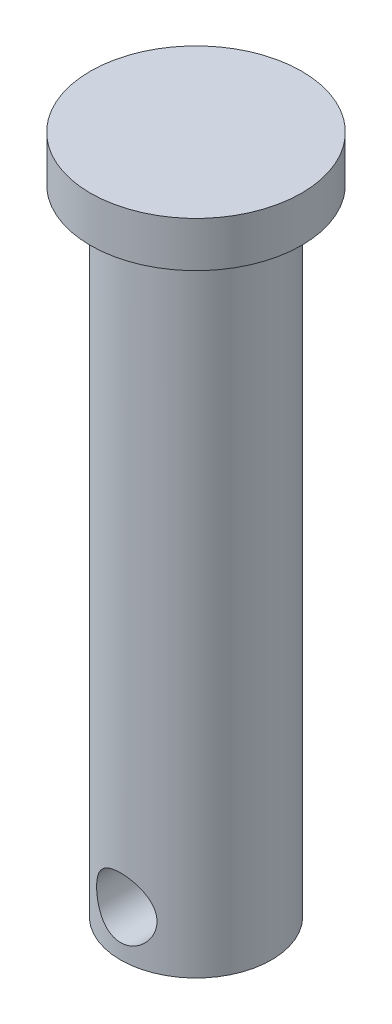
ISO-10303-21;
HEADER;
FILE_DESCRIPTION(('STEP AP214'),'2;1');
FILE_NAME('part.step','',(''),(''),'','','');
FILE_SCHEMA(('AUTOMOTIVE_DESIGN { 1 0 10303 214 1 1 1 1 }'));
ENDSEC;
DATA;
#1=APPLICATION_CONTEXT('core data for automotive mechanical design processes');
#2=APPLICATION_PROTOCOL_DEFINITION('international standard','automotive_design',2000,#1);
#3=PRODUCT_CONTEXT('',#1,'mechanical');
#4=PRODUCT('Part','Part','',(#3));
#5=PRODUCT_RELATED_PRODUCT_CATEGORY('part','',(#4));
#6=PRODUCT_DEFINITION_FORMATION('','',#4);
#7=PRODUCT_DEFINITION_CONTEXT('part definition',#1,'design');
#8=PRODUCT_DEFINITION('design','',#6,#7);
#9=PRODUCT_DEFINITION_SHAPE('','',#8);
#10=(LENGTH_UNIT() NAMED_UNIT(*) SI_UNIT(.MILLI.,.METRE.));
#11=(NAMED_UNIT(*) PLANE_ANGLE_UNIT() SI_UNIT($,.RADIAN.));
#12=(NAMED_UNIT(*) SI_UNIT($,.STERADIAN.) SOLID_ANGLE_UNIT());
#13=UNCERTAINTY_MEASURE_WITH_UNIT(LENGTH_MEASURE(1.E-05),#10,'distance_accuracy_value','');
#14=(GEOMETRIC_REPRESENTATION_CONTEXT(3) GLOBAL_UNCERTAINTY_ASSIGNED_CONTEXT((#13)) GLOBAL_UNIT_ASSIGNED_CONTEXT((#10,
#11,#12)) REPRESENTATION_CONTEXT('',''));
#15=CARTESIAN_POINT('',(0.,0.,0.));
#16=DIRECTION('',(0.,0.,1.));
#17=DIRECTION('',(1.,0.,0.));
#18=AXIS2_PLACEMENT_3D('',#15,#16,#17);
#19=CARTESIAN_POINT('',(0.,-3.,0.));
#20=DIRECTION('',(0.,1.,0.));
#21=DIRECTION('',(0.,0.,1.));
#22=AXIS2_PLACEMENT_3D('',#19,#20,#21);
#23=CYLINDRICAL_SURFACE('',#22,7.);
#24=CARTESIAN_POINT('',(0.,-3.,0.));
#25=DIRECTION('',(0.,1.,0.));
#26=DIRECTION('',(1.,0.,0.));
#27=AXIS2_PLACEMENT_3D('',#24,#25,#26);
#28=CIRCLE('',#27,7.);
#29=CARTESIAN_POINT('',(7.,-3.,0.));
#30=VERTEX_POINT('',#29);
#31=EDGE_CURVE('E10',#30,#30,#28,.T.);
#32=ORIENTED_EDGE('',*,*,#31,.T.);
#33=EDGE_LOOP('',(#32));
#34=FACE_BOUND('',#33,.T.);
#35=CARTESIAN_POINT('',(0.,0.,0.));
#36=DIRECTION('',(0.,1.,0.));
#37=DIRECTION('',(1.,0.,0.));
#38=AXIS2_PLACEMENT_3D('',#35,#36,#37);
#39=CIRCLE('',#38,7.);
#40=CARTESIAN_POINT('',(7.,0.,0.));
#41=VERTEX_POINT('',#40);
#42=EDGE_CURVE('E23',#41,#41,#39,.T.);
#43=ORIENTED_EDGE('',*,*,#42,.F.);
#44=EDGE_LOOP('',(#43));
#45=FACE_BOUND('',#44,.T.);
#46=ADVANCED_FACE('F15',(#34,#45),#23,.T.);
#47=CARTESIAN_POINT('',(0.,-3.,0.));
#48=DIRECTION('',(0.,1.,0.));
#49=DIRECTION('',(0.,0.,1.));
#50=AXIS2_PLACEMENT_3D('',#47,#48,#49);
#51=PLANE('',#50);
#52=CARTESIAN_POINT('',(0.,-3.,0.));
#53=DIRECTION('',(0.,1.,0.));
#54=DIRECTION('',(1.,0.,0.));
#55=AXIS2_PLACEMENT_3D('',#52,#53,#54);
#56=CIRCLE('',#55,4.);
#57=CARTESIAN_POINT('',(4.,-3.,0.));
#58=VERTEX_POINT('',#57);
#59=EDGE_CURVE('E29',#58,#58,#56,.T.);
#60=ORIENTED_EDGE('',*,*,#59,.T.);
#61=EDGE_LOOP('',(#60));
#62=FACE_BOUND('',#61,.T.);
#63=ORIENTED_EDGE('',*,*,#31,.F.);
#64=EDGE_LOOP('',(#63));
#65=FACE_BOUND('',#64,.T.);
#66=ADVANCED_FACE('F61',(#62,#65),#51,.F.);
#67=CARTESIAN_POINT('',(0.,0.,0.));
#68=DIRECTION('',(0.,1.,0.));
#69=DIRECTION('',(0.,0.,1.));
#70=AXIS2_PLACEMENT_3D('',#67,#68,#69);
#71=PLANE('',#70);
#72=ORIENTED_EDGE('',*,*,#42,.T.);
#73=EDGE_LOOP('',(#72));
#74=FACE_BOUND('',#73,.T.);
#75=ADVANCED_FACE('F62',(#74),#71,.T.);
#76=CARTESIAN_POINT('',(0.,-5.,0.));
#77=DIRECTION('',(0.,1.,0.));
#78=DIRECTION('',(0.,0.,1.));
#79=AXIS2_PLACEMENT_3D('',#76,#77,#78);
#80=CYLINDRICAL_SURFACE('',#79,4.);
#81=CARTESIAN_POINT('',(0.,-4.,0.));
#82=DIRECTION('',(0.,1.,0.));
#83=DIRECTION('',(1.,0.,0.));
#84=AXIS2_PLACEMENT_3D('',#81,#82,#83);
#85=CIRCLE('',#84,4.);
#86=CARTESIAN_POINT('',(4.,-4.,0.));
#87=VERTEX_POINT('',#86);
#88=EDGE_CURVE('E34',#87,#87,#85,.T.);
#89=ORIENTED_EDGE('',*,*,#88,.T.);
#90=EDGE_LOOP('',(#89));
#91=FACE_BOUND('',#90,.T.);
#92=ORIENTED_EDGE('',*,*,#59,.F.);
#93=EDGE_LOOP('',(#92));
#94=FACE_BOUND('',#93,.T.);
#95=ADVANCED_FACE('F65',(#91,#94),#80,.T.);
#96=CARTESIAN_POINT('',(0.,-33.,0.));
#97=DIRECTION('',(0.,1.,0.));
#98=DIRECTION('',(0.,0.,1.));
#99=AXIS2_PLACEMENT_3D('',#96,#97,#98);
#100=CYLINDRICAL_SURFACE('',#99,5.);
#101=CARTESIAN_POINT('',(-0.289990186545229,-40.0211352517902,4.99158348539894));
#102=CARTESIAN_POINT('',(-0.399256561433886,-40.0371434157383,4.98523872501269));
#103=CARTESIAN_POINT('',(-0.506957630692828,-40.0622029874916,4.97534846513488));
#104=CARTESIAN_POINT('',(-0.716116179366296,-40.1293733943494,4.94957422756613));
#105=CARTESIAN_POINT('',(-0.817573630168048,-40.1714843075888,4.93369022240988));
#106=CARTESIAN_POINT('',(-1.01138078716051,-40.2711394430453,4.89763347932635));
#107=CARTESIAN_POINT('',(-1.10375348375212,-40.3286432610721,4.87747199750204));
#108=CARTESIAN_POINT('',(-1.27766855466854,-40.4575071658094,4.83483097763648));
#109=CARTESIAN_POINT('',(-1.35920781478638,-40.5288712223679,4.81235077633492));
#110=CARTESIAN_POINT('',(-1.5132308667781,-40.6874044389007,4.7662247945751));
#111=CARTESIAN_POINT('',(-1.58511573252802,-40.7751550760537,4.74257350819741));
#112=CARTESIAN_POINT('',(-1.71329529570738,-40.9619961246273,4.69779114013401));
#113=CARTESIAN_POINT('',(-1.76958895091026,-41.0610872935037,4.67666022698156));
#114=CARTESIAN_POINT('',(-1.86495785446191,-41.2685625638644,4.63945858102167));
#115=CARTESIAN_POINT('',(-1.90397780753836,-41.3769752007656,4.62340414484151));
#116=CARTESIAN_POINT('',(-1.96289797551421,-41.5996618578559,4.59870362095271));
#117=CARTESIAN_POINT('',(-1.98281225767988,-41.7139315001992,4.59005208309094));
#118=CARTESIAN_POINT('',(-2.0018416067249,-41.9359163350853,4.58178171316505));
#119=CARTESIAN_POINT('',(-2.00239402844413,-42.0434865812977,4.58153868247463));
#120=CARTESIAN_POINT('',(-1.98629793324964,-42.2570736208959,4.58853963970683));
#121=CARTESIAN_POINT('',(-1.96965068017554,-42.3630905278411,4.5957830775205));
#122=CARTESIAN_POINT('',(-1.92069563273693,-42.5670798448486,4.61644832473827));
#123=CARTESIAN_POINT('',(-1.88891543224747,-42.6652017921123,4.62966127211301));
#124=CARTESIAN_POINT('',(-1.81103012256513,-42.8547991602887,4.66067795153207));
#125=CARTESIAN_POINT('',(-1.76492108639147,-42.9462727506534,4.67848294185031));
#126=CARTESIAN_POINT('',(-1.65636671073025,-43.1261243598775,4.71804837103209));
#127=CARTESIAN_POINT('',(-1.59308564852515,-43.2139586723753,4.7399856242558));
#128=CARTESIAN_POINT('',(-1.45333241729006,-43.3782097199795,4.78468428944806));
#129=CARTESIAN_POINT('',(-1.37685490043638,-43.4546218027408,4.80744603257258));
#130=CARTESIAN_POINT('',(-1.20732008118509,-43.5985866726349,4.85288858520168));
#131=CARTESIAN_POINT('',(-1.11353689206865,-43.6653169848096,4.87548011817638));
#132=CARTESIAN_POINT('',(-0.915235013945701,-43.782013077271,4.9165617812804));
#133=CARTESIAN_POINT('',(-0.810718442994599,-43.8319821568385,4.93505271832785));
#134=CARTESIAN_POINT('',(-0.596619367362931,-43.912268053459,4.96542246713126));
#135=CARTESIAN_POINT('',(-0.487239677522068,-43.9430627763796,4.97746093486572));
#136=CARTESIAN_POINT('',(-0.264319712078173,-43.9856976513792,4.99425699686345));
#137=CARTESIAN_POINT('',(-0.15078153136026,-43.9975472165225,4.99901820684296));
#138=CARTESIAN_POINT('',(0.0692417884098615,-44.0016283753635,5.00065200458868));
#139=CARTESIAN_POINT('',(0.175702479622863,-43.9950925238408,4.99802023303859));
#140=CARTESIAN_POINT('',(0.385868946646565,-43.9652909845271,4.98619919233112));
#141=CARTESIAN_POINT('',(0.489574801187298,-43.9420257753762,4.97701011078362));
#142=CARTESIAN_POINT('',(0.690496106620371,-43.8799414412392,4.95311744274761));
#143=CARTESIAN_POINT('',(0.78776084077549,-43.8412616729447,4.93846333750426));
#144=CARTESIAN_POINT('',(0.974526599430866,-43.7496077178898,4.9050290805781));
#145=CARTESIAN_POINT('',(1.06402562490393,-43.6966298648971,4.8862478708768));
#146=CARTESIAN_POINT('',(1.23832104502264,-43.574338775802,4.84510484587857));
#147=CARTESIAN_POINT('',(1.32254340958176,-43.5042561680168,4.82259851660494));
#148=CARTESIAN_POINT('',(1.47842107035395,-43.3513695058204,4.77712012479087));
#149=CARTESIAN_POINT('',(1.55007078982947,-43.2685598365741,4.75414786059438));
#150=CARTESIAN_POINT('',(1.68232802416517,-43.0876291700233,4.70902338719547));
#151=CARTESIAN_POINT('',(1.74221305558973,-42.9889530351789,4.68696811559613));
#152=CARTESIAN_POINT('',(1.84439752206775,-42.7819858609596,4.64771048372213));
#153=CARTESIAN_POINT('',(1.88670359268148,-42.6736984683288,4.63050629309127));
#154=CARTESIAN_POINT('',(1.95082581438116,-42.4547462295606,4.60385176962895));
#155=CARTESIAN_POINT('',(1.97335097814202,-42.3443228980858,4.59413481065542));
#156=CARTESIAN_POINT('',(1.99950579657706,-42.1208749792119,4.58281506560451));
#157=CARTESIAN_POINT('',(2.00314608394022,-42.0078518915599,4.58120771361614));
#158=CARTESIAN_POINT('',(1.99181525088973,-41.7912752199498,4.58614123110232));
#159=CARTESIAN_POINT('',(1.97818746292478,-41.6876342622831,4.59209405196492));
#160=CARTESIAN_POINT('',(1.93515726129263,-41.4842757243387,4.61039110517769));
#161=CARTESIAN_POINT('',(1.90575253895001,-41.384558720555,4.62273627292558));
#162=CARTESIAN_POINT('',(1.83181621139365,-41.1904566176295,4.65253082602945));
#163=CARTESIAN_POINT('',(1.78712034339769,-41.0961429769475,4.67003533959029));
#164=CARTESIAN_POINT('',(1.68399282435204,-40.9160508496893,4.7082040139314));
#165=CARTESIAN_POINT('',(1.6255562057506,-40.8302754658607,4.72886931645248));
#166=CARTESIAN_POINT('',(1.49132119509402,-40.6627067373292,4.77297793335028));
#167=CARTESIAN_POINT('',(1.41453201072785,-40.5817294079786,4.79651261034738));
#168=CARTESIAN_POINT('',(1.24836791995678,-40.433481828864,4.84241699603871));
#169=CARTESIAN_POINT('',(1.15899029884767,-40.3662145433564,4.86478645202319));
#170=CARTESIAN_POINT('',(0.967000197694048,-40.2455449669095,4.90660908575644));
#171=CARTESIAN_POINT('',(0.86408736912542,-40.192583300369,4.92596314879481));
#172=CARTESIAN_POINT('',(0.649846578511359,-40.104984525262,4.95877276118414));
#173=CARTESIAN_POINT('',(0.538520472060921,-40.0703433894036,4.97222960677337));
#174=CARTESIAN_POINT('',(0.307894562301504,-40.0202333434538,4.99188547669335));
#175=CARTESIAN_POINT('',(0.188462454538235,-40.0052886925852,4.99788580393576));
#176=CARTESIAN_POINT('',(-0.0512564127055369,-39.9970651869128,5.00117287708119));
#177=CARTESIAN_POINT('',(-0.17154299836821,-40.0037820449188,4.99846134721301));
#178=CARTESIAN_POINT('',(-0.289990186545229,-40.0211352517902,4.99158348539894));
#179=B_SPLINE_CURVE_WITH_KNOTS('',3,(#101,#102,#103,#104,#105,#106,#107,#108,#109,#110,#111,
#112,#113,#114,#115,#116,#117,#118,#119,#120,#121,#122,#123,#124,#125,#126,#127,#128,#129,#130,
#131,#132,#133,#134,#135,#136,#137,#138,#139,#140,#141,#142,#143,#144,#145,#146,#147,#148,#149,
#150,#151,#152,#153,#154,#155,#156,#157,#158,#159,#160,#161,#162,#163,#164,#165,#166,#167,#168,
#169,#170,#171,#172,#173,#174,#175,#176,#177,#178),.UNSPECIFIED.,.T.,.F.,(4,2,2,2,2,2,2,2,2,2,2,
2,2,2,2,2,2,2,2,2,2,2,2,2,2,2,2,2,2,2,2,2,2,2,2,2,2,2,4),(0.,0.331380876290187,
0.662763271094066,0.993284221629077,1.32389997992274,1.66991992941874,2.01596300375067,
2.36310593345009,2.70999306955227,3.03106935326658,3.35212204583329,3.66272053403598,
3.97340422047813,4.30335366168009,4.63343712928385,4.98361442919874,5.33372275971438,
5.67471336444453,6.01553449235323,6.33406173209539,6.65257985888418,6.96828144746515,
7.28406406345922,7.61816631581788,7.9524163904131,8.30321800982488,8.65388709099427,
8.99140337607521,9.32872960984772,9.6413545522147,9.95402525419651,10.2701661114295,
10.5864214360013,10.9270437975991,11.2677397274109,11.6179687083401,11.9681206685062,
12.3274160381617,12.6866403013645),.UNSPECIFIED.);
#180=CARTESIAN_POINT('',(-0.289990186545229,-40.0211352517902,4.99158348539894));
#181=VERTEX_POINT('',#180);
#182=EDGE_CURVE('E37',#181,#181,#179,.T.);
#183=ORIENTED_EDGE('',*,*,#182,.F.);
#184=EDGE_LOOP('',(#183));
#185=FACE_BOUND('',#184,.T.);
#186=CARTESIAN_POINT('',(1.97822707335848,-42.294308760032,-4.59201672974212));
#187=CARTESIAN_POINT('',(1.96195307603636,-42.4037247689916,-4.59902487384295));
#188=CARTESIAN_POINT('',(1.93660509917972,-42.5115107765528,-4.60987135354613));
#189=CARTESIAN_POINT('',(1.86886446977255,-42.7207235203894,-4.63774462949755));
#190=CARTESIAN_POINT('',(1.82646799617321,-42.8221488251572,-4.65477281115625));
#191=CARTESIAN_POINT('',(1.72626712733635,-43.0158047120301,-4.69285112505943));
#192=CARTESIAN_POINT('',(1.6685095007621,-43.1080620550004,-4.7138889951906));
#193=CARTESIAN_POINT('',(1.53908868983479,-43.2817734727334,-4.75771666835683));
#194=CARTESIAN_POINT('',(1.46742263075088,-43.3632253082385,-4.78050683298424));
#195=CARTESIAN_POINT('',(1.30785160487149,-43.5173791971347,-4.82667113238387));
#196=CARTESIAN_POINT('',(1.21930989367899,-43.5894327082263,-4.85001674264226));
#197=CARTESIAN_POINT('',(1.03071889465492,-43.7177368447839,-4.8935642445029));
#198=CARTESIAN_POINT('',(0.930670199854801,-43.7739882841221,-4.91376629798741));
#199=CARTESIAN_POINT('',(0.722469630726286,-43.8684188472102,-4.94864363452235));
#200=CARTESIAN_POINT('',(0.614391685446546,-43.9067437102723,-4.96336328120053));
#201=CARTESIAN_POINT('',(0.392604856921861,-43.9644263946652,-4.98580542758547));
#202=CARTESIAN_POINT('',(0.278898999251581,-43.9837942933987,-4.9935316447907));
#203=CARTESIAN_POINT('',(0.0572132457022675,-44.0020664258918,-5.0008209851201));
#204=CARTESIAN_POINT('',(-0.0506466727130661,-44.0022418691718,-5.00089120128447));
#205=CARTESIAN_POINT('',(-0.264767515163509,-43.9853029758252,-4.99413325547814));
#206=CARTESIAN_POINT('',(-0.371028615785814,-43.9681905630577,-4.98730586110007));
#207=CARTESIAN_POINT('',(-0.576373649542231,-43.9179946028742,-4.96771470527133));
#208=CARTESIAN_POINT('',(-0.675568605830268,-43.8853040378255,-4.95509728146251));
#209=CARTESIAN_POINT('',(-0.867085181018579,-43.8052540902451,-4.92519721309206));
#210=CARTESIAN_POINT('',(-0.959405385830719,-43.7578917001031,-4.90791361209374));
#211=CARTESIAN_POINT('',(-1.13951067884633,-43.6471893909907,-4.86933402465205));
#212=CARTESIAN_POINT('',(-1.22684920322109,-43.5831780563828,-4.84788247265201));
#213=CARTESIAN_POINT('',(-1.38993275557232,-43.4421239431128,-4.80366932960679));
#214=CARTESIAN_POINT('',(-1.46567252522456,-43.3650752870708,-4.78090715078224));
#215=CARTESIAN_POINT('',(-1.60798285512857,-43.1947454754728,-4.73500907046552));
#216=CARTESIAN_POINT('',(-1.67375099395853,-43.1007756828008,-4.71193007219282));
#217=CARTESIAN_POINT('',(-1.78855970579952,-42.9023230717935,-4.66956259225793));
#218=CARTESIAN_POINT('',(-1.83760290879909,-42.7978419097155,-4.65027351483478));
#219=CARTESIAN_POINT('',(-1.91642778362083,-42.5831935164848,-4.61834308363973));
#220=CARTESIAN_POINT('',(-1.94656414445564,-42.4731756221408,-4.60558020269799));
#221=CARTESIAN_POINT('',(-1.98769839982561,-42.2490281295468,-4.58798157746719));
#222=CARTESIAN_POINT('',(-1.99870941563086,-42.1349014051427,-4.58314039849117));
#223=CARTESIAN_POINT('',(-2.00098568793703,-41.9152456292439,-4.5821441676998));
#224=CARTESIAN_POINT('',(-1.9937067168622,-41.809731529411,-4.58534870885478));
#225=CARTESIAN_POINT('',(-1.96273972510626,-41.6015991645168,-4.59868806977228));
#226=CARTESIAN_POINT('',(-1.93905062937996,-41.4989810896356,-4.6088233435741));
#227=CARTESIAN_POINT('',(-1.87649031938813,-41.3003324129258,-4.63464178762853));
#228=CARTESIAN_POINT('',(-1.83776268008949,-41.2042493235377,-4.6502723637938));
#229=CARTESIAN_POINT('',(-1.74633948486857,-41.0197406325103,-4.68536964237703));
#230=CARTESIAN_POINT('',(-1.69363947959806,-40.9313174820165,-4.70483756624916));
#231=CARTESIAN_POINT('',(-1.57127372335801,-40.7577525470059,-4.74716545519638));
#232=CARTESIAN_POINT('',(-1.50065140634638,-40.6733195993458,-4.77016922955712));
#233=CARTESIAN_POINT('',(-1.3464906686106,-40.517092884874,-4.81595522208197));
#234=CARTESIAN_POINT('',(-1.26294774909273,-40.4453035391002,-4.83873736012709));
#235=CARTESIAN_POINT('',(-1.08076629067351,-40.3132418503639,-4.88273474993203));
#236=CARTESIAN_POINT('',(-0.981619899278766,-40.253627769769,-4.90383443894914));
#237=CARTESIAN_POINT('',(-0.773750238289246,-40.1521163003016,-4.940893881272));
#238=CARTESIAN_POINT('',(-0.665030505106122,-40.1102124021522,-4.95685552252297));
#239=CARTESIAN_POINT('',(-0.446088375554123,-40.0472050359891,-4.98122473496029));
#240=CARTESIAN_POINT('',(-0.336138235574621,-40.0252742200632,-4.9899313595398));
#241=CARTESIAN_POINT('',(-0.113802319145937,-40.0001121500545,-4.99994118784721));
#242=CARTESIAN_POINT('',(-0.00141754813073976,-39.9968733190938,-5.00124739136427));
#243=CARTESIAN_POINT('',(0.215483229593044,-40.0088534479519,-4.99646322058804));
#244=CARTESIAN_POINT('',(0.320070925294749,-40.0229901487127,-4.9908065100535));
#245=CARTESIAN_POINT('',(0.525237394134641,-40.0673482488693,-4.97340213120562));
#246=CARTESIAN_POINT('',(0.625815964223561,-40.0975704618346,-4.96165415481036));
#247=CARTESIAN_POINT('',(0.821304367983419,-40.1733755316026,-4.93308403132269));
#248=CARTESIAN_POINT('',(0.916152681700399,-40.2190988279798,-4.9162156450641));
#249=CARTESIAN_POINT('',(1.0970415834368,-40.3244508459736,-4.87904080177294));
#250=CARTESIAN_POINT('',(1.18307930923036,-40.3840840659047,-4.85873323313036));
#251=CARTESIAN_POINT('',(1.34982291179953,-40.5200394180799,-4.81517165322348));
#252=CARTESIAN_POINT('',(1.42982625010759,-40.5971902768182,-4.7918120671751));
#253=CARTESIAN_POINT('',(1.57608759372884,-40.7637792255504,-4.74571811482995));
#254=CARTESIAN_POINT('',(1.64234091927909,-40.8532214817142,-4.72298396367361));
#255=CARTESIAN_POINT('',(1.76137776523978,-41.0456567161361,-4.67992539493552));
#256=CARTESIAN_POINT('',(1.81362600152491,-41.1490073234615,-4.6597093478527));
#257=CARTESIAN_POINT('',(1.89972613549135,-41.3640441514979,-4.62527939205441));
#258=CARTESIAN_POINT('',(1.93358551679536,-41.4757269602155,-4.61106304219727));
#259=CARTESIAN_POINT('',(1.98164205867012,-41.7051307732081,-4.59062123172295));
#260=CARTESIAN_POINT('',(1.99564813715474,-41.8228992987527,-4.58447347009472));
#261=CARTESIAN_POINT('',(2.00261290371616,-42.0591657522667,-4.58143666727763));
#262=CARTESIAN_POINT('',(1.99557631222527,-42.1776635106984,-4.5845455495759));
#263=CARTESIAN_POINT('',(1.97822707335848,-42.294308760032,-4.59201672974212));
#264=B_SPLINE_CURVE_WITH_KNOTS('',3,(#186,#187,#188,#189,#190,#191,#192,#193,#194,#195,#196,
#197,#198,#199,#200,#201,#202,#203,#204,#205,#206,#207,#208,#209,#210,#211,#212,#213,#214,#215,
#216,#217,#218,#219,#220,#221,#222,#223,#224,#225,#226,#227,#228,#229,#230,#231,#232,#233,#234,
#235,#236,#237,#238,#239,#240,#241,#242,#243,#244,#245,#246,#247,#248,#249,#250,#251,#252,#253,
#254,#255,#256,#257,#258,#259,#260,#261,#262,#263),.UNSPECIFIED.,.T.,.F.,(4,2,2,2,2,2,2,2,2,2,2,
2,2,2,2,2,2,2,2,2,2,2,2,2,2,2,2,2,2,2,2,2,2,2,2,2,2,2,4),(0.,0.332057507228942,
0.664189479425517,0.995321592253774,1.32652221973712,1.67442810032522,2.02231605903472,
2.36732437719536,2.71214919133937,3.03411975421088,3.35605449090564,3.67026627573706,
3.98454251421748,4.31428026930364,4.64416707207752,4.99347687333457,5.34273172042898,
5.68522162160346,6.02747645877491,6.34336566551815,6.65927556846563,6.97224078812688,
7.28530578811264,7.62118758165652,7.95718658947286,8.3082049546665,8.65909419262023,
8.99468247433344,9.33013471430638,9.64571131490844,9.96130387819086,10.2798357070869,
10.5984706887919,10.937671116396,11.2769868008955,11.6278528441158,11.9785759898891,
12.3326523377598,12.6866492628174),.UNSPECIFIED.);
#265=CARTESIAN_POINT('',(1.97822707335848,-42.294308760032,-4.59201672974212));
#266=VERTEX_POINT('',#265);
#267=EDGE_CURVE('E44',#266,#266,#264,.T.);
#268=ORIENTED_EDGE('',*,*,#267,.F.);
#269=EDGE_LOOP('',(#268));
#270=FACE_BOUND('',#269,.T.);
#271=CARTESIAN_POINT('',(0.,-45.,0.));
#272=DIRECTION('',(0.,1.,0.));
#273=DIRECTION('',(0.,0.,1.));
#274=AXIS2_PLACEMENT_3D('',#271,#272,#273);
#275=CIRCLE('',#274,5.);
#276=CARTESIAN_POINT('',(0.,-45.,5.));
#277=VERTEX_POINT('',#276);
#278=EDGE_CURVE('E19',#277,#277,#275,.T.);
#279=ORIENTED_EDGE('',*,*,#278,.T.);
#280=EDGE_LOOP('',(#279));
#281=FACE_BOUND('',#280,.T.);
#282=CARTESIAN_POINT('',(0.,-4.,0.));
#283=DIRECTION('',(0.,1.,0.));
#284=DIRECTION('',(0.,0.,1.));
#285=AXIS2_PLACEMENT_3D('',#282,#283,#284);
#286=CIRCLE('',#285,5.);
#287=CARTESIAN_POINT('',(0.,-4.,5.));
#288=VERTEX_POINT('',#287);
#289=EDGE_CURVE('E43',#288,#288,#286,.T.);
#290=ORIENTED_EDGE('',*,*,#289,.F.);
#291=EDGE_LOOP('',(#290));
#292=FACE_BOUND('',#291,.T.);
#293=ADVANCED_FACE('F48',(#185,#270,#281,#292),#100,.T.);
#294=CARTESIAN_POINT('',(0.,-45.,0.));
#295=DIRECTION('',(0.,1.,0.));
#296=DIRECTION('',(0.,0.,1.));
#297=AXIS2_PLACEMENT_3D('',#294,#295,#296);
#298=PLANE('',#297);
#299=ORIENTED_EDGE('',*,*,#278,.F.);
#300=EDGE_LOOP('',(#299));
#301=FACE_BOUND('',#300,.T.);
#302=ADVANCED_FACE('F17',(#301),#298,.F.);
#303=CARTESIAN_POINT('',(0.,-4.,0.));
#304=DIRECTION('',(0.,1.,0.));
#305=DIRECTION('',(0.,0.,1.));
#306=AXIS2_PLACEMENT_3D('',#303,#304,#305);
#307=PLANE('',#306);
#308=ORIENTED_EDGE('',*,*,#88,.F.);
#309=EDGE_LOOP('',(#308));
#310=FACE_BOUND('',#309,.T.);
#311=ORIENTED_EDGE('',*,*,#289,.T.);
#312=EDGE_LOOP('',(#311));
#313=FACE_BOUND('',#312,.T.);
#314=ADVANCED_FACE('F56',(#310,#313),#307,.T.);
#315=CARTESIAN_POINT('',(0.,-42.,39.5601718875943));
#316=DIRECTION('',(0.,0.,-1.));
#317=DIRECTION('',(-1.,0.,0.));
#318=AXIS2_PLACEMENT_3D('',#315,#316,#317);
#319=CYLINDRICAL_SURFACE('',#318,2.);
#320=ORIENTED_EDGE('',*,*,#182,.T.);
#321=EDGE_LOOP('',(#320));
#322=FACE_BOUND('',#321,.T.);
#323=ORIENTED_EDGE('',*,*,#267,.T.);
#324=EDGE_LOOP('',(#323));
#325=FACE_BOUND('',#324,.T.);
#326=ADVANCED_FACE('F52',(#322,#325),#319,.F.);
#327=CLOSED_SHELL('',(#46,#66,#75,#95,#293,#302,#314,#326));
#328=MANIFOLD_SOLID_BREP('B1',#327);
#329=ADVANCED_BREP_SHAPE_REPRESENTATION('',(#18,#328),#14);
#330=SHAPE_DEFINITION_REPRESENTATION(#9,#329);
ENDSEC;
END-ISO-10303-21;
